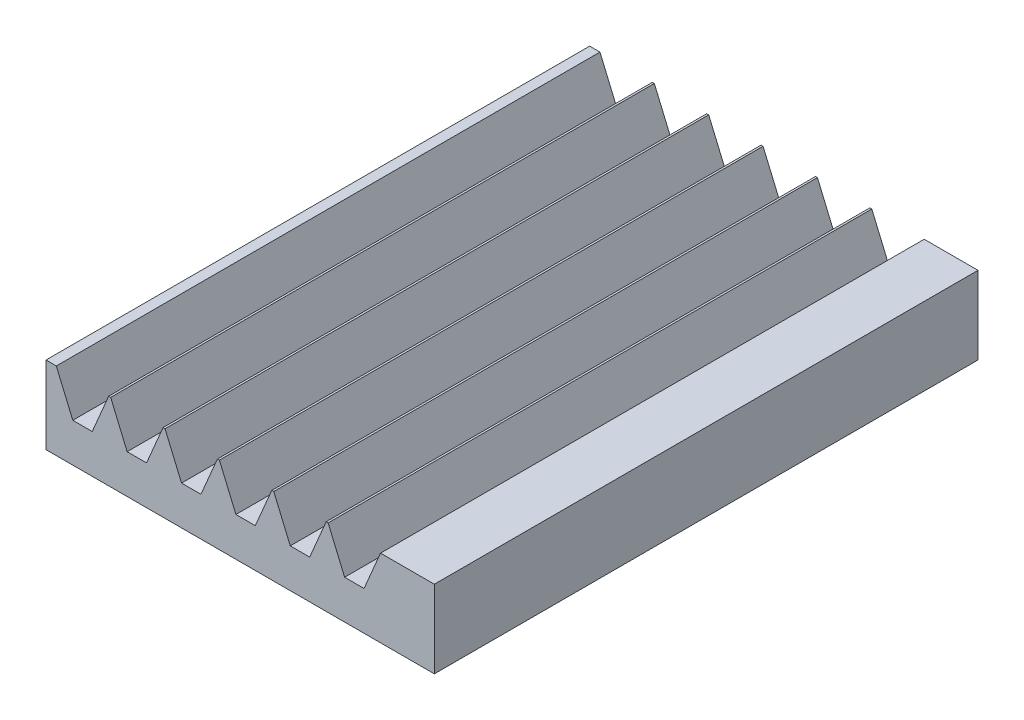
ISO-10303-21;
HEADER;
FILE_DESCRIPTION(('STEP AP214'),'2;1');
FILE_NAME('part.step','',(''),(''),'','','');
FILE_SCHEMA(('AUTOMOTIVE_DESIGN { 1 0 10303 214 1 1 1 1 }'));
ENDSEC;
DATA;
#1=APPLICATION_CONTEXT('core data for automotive mechanical design processes');
#2=APPLICATION_PROTOCOL_DEFINITION('international standard','automotive_design',2000,#1);
#3=PRODUCT_CONTEXT('',#1,'mechanical');
#4=PRODUCT('Part','Part','',(#3));
#5=PRODUCT_RELATED_PRODUCT_CATEGORY('part','',(#4));
#6=PRODUCT_DEFINITION_FORMATION('','',#4);
#7=PRODUCT_DEFINITION_CONTEXT('part definition',#1,'design');
#8=PRODUCT_DEFINITION('design','',#6,#7);
#9=PRODUCT_DEFINITION_SHAPE('','',#8);
#10=(LENGTH_UNIT() NAMED_UNIT(*) SI_UNIT(.MILLI.,.METRE.));
#11=(NAMED_UNIT(*) PLANE_ANGLE_UNIT() SI_UNIT($,.RADIAN.));
#12=(NAMED_UNIT(*) SI_UNIT($,.STERADIAN.) SOLID_ANGLE_UNIT());
#13=UNCERTAINTY_MEASURE_WITH_UNIT(LENGTH_MEASURE(1.E-05),#10,'distance_accuracy_value','');
#14=(GEOMETRIC_REPRESENTATION_CONTEXT(3) GLOBAL_UNCERTAINTY_ASSIGNED_CONTEXT((#13)) GLOBAL_UNIT_ASSIGNED_CONTEXT((#10,
#11,#12)) REPRESENTATION_CONTEXT('',''));
#15=CARTESIAN_POINT('',(0.,0.,0.));
#16=DIRECTION('',(0.,0.,1.));
#17=DIRECTION('',(1.,0.,0.));
#18=AXIS2_PLACEMENT_3D('',#15,#16,#17);
#19=CARTESIAN_POINT('',(0.,2.,-9.));
#20=DIRECTION('',(0.,1.,0.));
#21=DIRECTION('',(0.,0.,1.));
#22=AXIS2_PLACEMENT_3D('',#19,#20,#21);
#23=PLANE('',#22);
#24=DIRECTION('',(0.,0.,-1.));
#25=VECTOR('',#24,1.);
#26=CARTESIAN_POINT('',(3.01429944988273,2.,-9.));
#27=LINE('',#26,#25);
#28=CARTESIAN_POINT('',(3.01429944988273,2.,5.));
#29=VERTEX_POINT('',#28);
#30=CARTESIAN_POINT('',(3.01429944988273,2.,-9.));
#31=VERTEX_POINT('',#30);
#32=EDGE_CURVE('E321',#29,#31,#27,.T.);
#33=ORIENTED_EDGE('',*,*,#32,.F.);
#34=DIRECTION('',(-1.,0.,0.));
#35=VECTOR('',#34,1.);
#36=CARTESIAN_POINT('',(0.,2.,5.));
#37=LINE('',#36,#35);
#38=CARTESIAN_POINT('',(3.06534981746351,2.,5.));
#39=VERTEX_POINT('',#38);
#40=EDGE_CURVE('E396',#39,#29,#37,.T.);
#41=ORIENTED_EDGE('',*,*,#40,.F.);
#42=DIRECTION('',(0.,0.,1.));
#43=VECTOR('',#42,1.);
#44=CARTESIAN_POINT('',(3.06534981746351,2.,-9.));
#45=LINE('',#44,#43);
#46=CARTESIAN_POINT('',(3.06534981746351,2.,-9.));
#47=VERTEX_POINT('',#46);
#48=EDGE_CURVE('E55',#47,#39,#45,.T.);
#49=ORIENTED_EDGE('',*,*,#48,.F.);
#50=DIRECTION('',(-1.,0.,0.));
#51=VECTOR('',#50,1.);
#52=CARTESIAN_POINT('',(0.,2.,-9.));
#53=LINE('',#52,#51);
#54=EDGE_CURVE('E500',#47,#31,#53,.T.);
#55=ORIENTED_EDGE('',*,*,#54,.T.);
#56=EDGE_LOOP('',(#33,#41,#49,#55));
#57=FACE_BOUND('',#56,.T.);
#58=ADVANCED_FACE('F33',(#57),#23,.T.);
#59=DIRECTION('',(0.,0.,-1.));
#60=VECTOR('',#59,1.);
#61=CARTESIAN_POINT('',(4.41429944988273,2.,-9.));
#62=LINE('',#61,#60);
#63=CARTESIAN_POINT('',(4.41429944988273,2.,5.));
#64=VERTEX_POINT('',#63);
#65=CARTESIAN_POINT('',(4.41429944988273,2.,-9.));
#66=VERTEX_POINT('',#65);
#67=EDGE_CURVE('E313',#64,#66,#62,.T.);
#68=ORIENTED_EDGE('',*,*,#67,.F.);
#69=CARTESIAN_POINT('',(4.46534981746351,2.,5.));
#70=VERTEX_POINT('',#69);
#71=EDGE_CURVE('E403',#70,#64,#37,.T.);
#72=ORIENTED_EDGE('',*,*,#71,.F.);
#73=DIRECTION('',(0.,0.,1.));
#74=VECTOR('',#73,1.);
#75=CARTESIAN_POINT('',(4.46534981746351,2.,-9.));
#76=LINE('',#75,#74);
#77=CARTESIAN_POINT('',(4.46534981746351,2.,-9.));
#78=VERTEX_POINT('',#77);
#79=EDGE_CURVE('E298',#78,#70,#76,.T.);
#80=ORIENTED_EDGE('',*,*,#79,.F.);
#81=EDGE_CURVE('E447',#78,#66,#53,.T.);
#82=ORIENTED_EDGE('',*,*,#81,.T.);
#83=EDGE_LOOP('',(#68,#72,#80,#82));
#84=FACE_BOUND('',#83,.T.);
#85=ADVANCED_FACE('F445',(#84),#23,.T.);
#86=DIRECTION('',(0.,0.,-1.));
#87=VECTOR('',#86,1.);
#88=CARTESIAN_POINT('',(5.81429944988273,2.,-9.));
#89=LINE('',#88,#87);
#90=CARTESIAN_POINT('',(5.81429944988273,2.,5.));
#91=VERTEX_POINT('',#90);
#92=CARTESIAN_POINT('',(5.81429944988273,2.,-9.));
#93=VERTEX_POINT('',#92);
#94=EDGE_CURVE('E304',#91,#93,#89,.T.);
#95=ORIENTED_EDGE('',*,*,#94,.F.);
#96=CARTESIAN_POINT('',(5.86534981746351,2.,5.));
#97=VERTEX_POINT('',#96);
#98=EDGE_CURVE('E405',#97,#91,#37,.T.);
#99=ORIENTED_EDGE('',*,*,#98,.F.);
#100=DIRECTION('',(0.,0.,1.));
#101=VECTOR('',#100,1.);
#102=CARTESIAN_POINT('',(5.86534981746351,2.,-9.));
#103=LINE('',#102,#101);
#104=CARTESIAN_POINT('',(5.86534981746351,2.,-9.));
#105=VERTEX_POINT('',#104);
#106=EDGE_CURVE('E288',#105,#97,#103,.T.);
#107=ORIENTED_EDGE('',*,*,#106,.F.);
#108=EDGE_CURVE('E423',#105,#93,#53,.T.);
#109=ORIENTED_EDGE('',*,*,#108,.T.);
#110=EDGE_LOOP('',(#95,#99,#107,#109));
#111=FACE_BOUND('',#110,.T.);
#112=ADVANCED_FACE('F420',(#111),#23,.T.);
#113=DIRECTION('',(0.,0.,-1.));
#114=VECTOR('',#113,1.);
#115=CARTESIAN_POINT('',(7.21429944988273,2.,-9.));
#116=LINE('',#115,#114);
#117=CARTESIAN_POINT('',(7.21429944988273,2.,5.));
#118=VERTEX_POINT('',#117);
#119=CARTESIAN_POINT('',(7.21429944988273,2.,-9.));
#120=VERTEX_POINT('',#119);
#121=EDGE_CURVE('E294',#118,#120,#116,.T.);
#122=ORIENTED_EDGE('',*,*,#121,.F.);
#123=CARTESIAN_POINT('',(7.26534981746351,2.,5.));
#124=VERTEX_POINT('',#123);
#125=EDGE_CURVE('E358',#124,#118,#37,.T.);
#126=ORIENTED_EDGE('',*,*,#125,.F.);
#127=DIRECTION('',(0.,0.,1.));
#128=VECTOR('',#127,1.);
#129=CARTESIAN_POINT('',(7.26534981746351,2.,-9.));
#130=LINE('',#129,#128);
#131=CARTESIAN_POINT('',(7.26534981746351,2.,-9.));
#132=VERTEX_POINT('',#131);
#133=EDGE_CURVE('E278',#132,#124,#130,.T.);
#134=ORIENTED_EDGE('',*,*,#133,.F.);
#135=EDGE_CURVE('E373',#132,#120,#53,.T.);
#136=ORIENTED_EDGE('',*,*,#135,.T.);
#137=EDGE_LOOP('',(#122,#126,#134,#136));
#138=FACE_BOUND('',#137,.T.);
#139=ADVANCED_FACE('F494',(#138),#23,.T.);
#140=DIRECTION('',(0.,0.,-1.));
#141=VECTOR('',#140,1.);
#142=CARTESIAN_POINT('',(8.61429944988273,2.,-9.));
#143=LINE('',#142,#141);
#144=CARTESIAN_POINT('',(8.61429944988273,2.,5.));
#145=VERTEX_POINT('',#144);
#146=CARTESIAN_POINT('',(8.61429944988273,2.,-9.));
#147=VERTEX_POINT('',#146);
#148=EDGE_CURVE('E284',#145,#147,#143,.T.);
#149=ORIENTED_EDGE('',*,*,#148,.F.);
#150=CARTESIAN_POINT('',(10.,2.,5.));
#151=VERTEX_POINT('',#150);
#152=EDGE_CURVE('E354',#151,#145,#37,.T.);
#153=ORIENTED_EDGE('',*,*,#152,.F.);
#154=DIRECTION('',(0.,0.,1.));
#155=VECTOR('',#154,1.);
#156=CARTESIAN_POINT('',(10.,2.,-9.));
#157=LINE('',#156,#155);
#158=CARTESIAN_POINT('',(10.,2.,-9.));
#159=VERTEX_POINT('',#158);
#160=EDGE_CURVE('E379',#159,#151,#157,.T.);
#161=ORIENTED_EDGE('',*,*,#160,.F.);
#162=EDGE_CURVE('E369',#159,#147,#53,.T.);
#163=ORIENTED_EDGE('',*,*,#162,.T.);
#164=EDGE_LOOP('',(#149,#153,#161,#163));
#165=FACE_BOUND('',#164,.T.);
#166=ADVANCED_FACE('F489',(#165),#23,.T.);
#167=DIRECTION('',(0.,0.,1.));
#168=VECTOR('',#167,1.);
#169=CARTESIAN_POINT('',(1.66534981746351,2.,-9.));
#170=LINE('',#169,#168);
#171=CARTESIAN_POINT('',(1.66534981746351,2.,-9.));
#172=VERTEX_POINT('',#171);
#173=CARTESIAN_POINT('',(1.66534981746351,2.,5.));
#174=VERTEX_POINT('',#173);
#175=EDGE_CURVE('E48',#172,#174,#170,.T.);
#176=ORIENTED_EDGE('',*,*,#175,.F.);
#177=CARTESIAN_POINT('',(1.61429944988273,2.,-9.));
#178=VERTEX_POINT('',#177);
#179=EDGE_CURVE('E374',#172,#178,#53,.T.);
#180=ORIENTED_EDGE('',*,*,#179,.T.);
#181=DIRECTION('',(0.,0.,-1.));
#182=VECTOR('',#181,1.);
#183=CARTESIAN_POINT('',(1.61429944988273,2.,-9.));
#184=LINE('',#183,#182);
#185=CARTESIAN_POINT('',(1.61429944988273,2.,5.));
#186=VERTEX_POINT('',#185);
#187=EDGE_CURVE('E341',#186,#178,#184,.T.);
#188=ORIENTED_EDGE('',*,*,#187,.F.);
#189=EDGE_CURVE('E359',#174,#186,#37,.T.);
#190=ORIENTED_EDGE('',*,*,#189,.F.);
#191=EDGE_LOOP('',(#176,#180,#188,#190));
#192=FACE_BOUND('',#191,.T.);
#193=ADVANCED_FACE('F479',(#192),#23,.T.);
#194=CARTESIAN_POINT('',(0.,0.,-9.));
#195=DIRECTION('',(-1.,0.,0.));
#196=DIRECTION('',(0.,0.,1.));
#197=AXIS2_PLACEMENT_3D('',#194,#195,#196);
#198=PLANE('',#197);
#199=DIRECTION('',(0.,0.,1.));
#200=VECTOR('',#199,1.);
#201=CARTESIAN_POINT('',(0.,0.,-9.));
#202=LINE('',#201,#200);
#203=CARTESIAN_POINT('',(0.,0.,-9.));
#204=VERTEX_POINT('',#203);
#205=CARTESIAN_POINT('',(0.,0.,5.));
#206=VERTEX_POINT('',#205);
#207=EDGE_CURVE('E372',#204,#206,#202,.T.);
#208=ORIENTED_EDGE('',*,*,#207,.T.);
#209=DIRECTION('',(0.,-1.,0.));
#210=VECTOR('',#209,1.);
#211=CARTESIAN_POINT('',(0.,0.,5.));
#212=LINE('',#211,#210);
#213=CARTESIAN_POINT('',(0.,2.,5.));
#214=VERTEX_POINT('',#213);
#215=EDGE_CURVE('E344',#214,#206,#212,.T.);
#216=ORIENTED_EDGE('',*,*,#215,.F.);
#217=DIRECTION('',(0.,0.,1.));
#218=VECTOR('',#217,1.);
#219=CARTESIAN_POINT('',(0.,2.,-9.));
#220=LINE('',#219,#218);
#221=CARTESIAN_POINT('',(0.,2.,-9.));
#222=VERTEX_POINT('',#221);
#223=EDGE_CURVE('E375',#222,#214,#220,.T.);
#224=ORIENTED_EDGE('',*,*,#223,.F.);
#225=DIRECTION('',(0.,-1.,0.));
#226=VECTOR('',#225,1.);
#227=CARTESIAN_POINT('',(0.,0.,-9.));
#228=LINE('',#227,#226);
#229=EDGE_CURVE('E357',#222,#204,#228,.T.);
#230=ORIENTED_EDGE('',*,*,#229,.T.);
#231=EDGE_LOOP('',(#208,#216,#224,#230));
#232=FACE_BOUND('',#231,.T.);
#233=ADVANCED_FACE('F35',(#232),#198,.T.);
#234=DIRECTION('',(0.,0.,1.));
#235=VECTOR('',#234,1.);
#236=CARTESIAN_POINT('',(0.265349817463512,2.,-9.));
#237=LINE('',#236,#235);
#238=CARTESIAN_POINT('',(0.265349817463512,2.,-9.));
#239=VERTEX_POINT('',#238);
#240=CARTESIAN_POINT('',(0.265349817463512,2.,5.));
#241=VERTEX_POINT('',#240);
#242=EDGE_CURVE('E335',#239,#241,#237,.T.);
#243=ORIENTED_EDGE('',*,*,#242,.F.);
#244=EDGE_CURVE('E368',#239,#222,#53,.T.);
#245=ORIENTED_EDGE('',*,*,#244,.T.);
#246=ORIENTED_EDGE('',*,*,#223,.T.);
#247=EDGE_CURVE('E353',#241,#214,#37,.T.);
#248=ORIENTED_EDGE('',*,*,#247,.F.);
#249=EDGE_LOOP('',(#243,#245,#246,#248));
#250=FACE_BOUND('',#249,.T.);
#251=ADVANCED_FACE('F470',(#250),#23,.T.);
#252=CARTESIAN_POINT('',(10.,0.,-9.));
#253=DIRECTION('',(1.,0.,0.));
#254=DIRECTION('',(0.,0.,-1.));
#255=AXIS2_PLACEMENT_3D('',#252,#253,#254);
#256=PLANE('',#255);
#257=ORIENTED_EDGE('',*,*,#160,.T.);
#258=DIRECTION('',(0.,1.,0.));
#259=VECTOR('',#258,1.);
#260=CARTESIAN_POINT('',(10.,0.,5.));
#261=LINE('',#260,#259);
#262=CARTESIAN_POINT('',(10.,0.,5.));
#263=VERTEX_POINT('',#262);
#264=EDGE_CURVE('E350',#263,#151,#261,.T.);
#265=ORIENTED_EDGE('',*,*,#264,.F.);
#266=DIRECTION('',(0.,0.,1.));
#267=VECTOR('',#266,1.);
#268=CARTESIAN_POINT('',(10.,0.,-9.));
#269=LINE('',#268,#267);
#270=CARTESIAN_POINT('',(10.,0.,-9.));
#271=VERTEX_POINT('',#270);
#272=EDGE_CURVE('E381',#271,#263,#269,.T.);
#273=ORIENTED_EDGE('',*,*,#272,.F.);
#274=DIRECTION('',(0.,1.,0.));
#275=VECTOR('',#274,1.);
#276=CARTESIAN_POINT('',(10.,0.,-9.));
#277=LINE('',#276,#275);
#278=EDGE_CURVE('E365',#271,#159,#277,.T.);
#279=ORIENTED_EDGE('',*,*,#278,.T.);
#280=EDGE_LOOP('',(#257,#265,#273,#279));
#281=FACE_BOUND('',#280,.T.);
#282=ADVANCED_FACE('F477',(#281),#256,.T.);
#283=CARTESIAN_POINT('',(0.,0.,-9.));
#284=DIRECTION('',(0.,-1.,0.));
#285=DIRECTION('',(0.,0.,-1.));
#286=AXIS2_PLACEMENT_3D('',#283,#284,#285);
#287=PLANE('',#286);
#288=ORIENTED_EDGE('',*,*,#272,.T.);
#289=DIRECTION('',(1.,0.,0.));
#290=VECTOR('',#289,1.);
#291=CARTESIAN_POINT('',(0.,0.,5.));
#292=LINE('',#291,#290);
#293=EDGE_CURVE('E347',#206,#263,#292,.T.);
#294=ORIENTED_EDGE('',*,*,#293,.F.);
#295=ORIENTED_EDGE('',*,*,#207,.F.);
#296=DIRECTION('',(1.,0.,0.));
#297=VECTOR('',#296,1.);
#298=CARTESIAN_POINT('',(0.,0.,-9.));
#299=LINE('',#298,#297);
#300=EDGE_CURVE('E362',#204,#271,#299,.T.);
#301=ORIENTED_EDGE('',*,*,#300,.T.);
#302=EDGE_LOOP('',(#288,#294,#295,#301));
#303=FACE_BOUND('',#302,.T.);
#304=ADVANCED_FACE('F484',(#303),#287,.T.);
#305=CARTESIAN_POINT('',(0.,0.,-9.));
#306=DIRECTION('',(0.,0.,-1.));
#307=DIRECTION('',(-1.,0.,0.));
#308=AXIS2_PLACEMENT_3D('',#305,#306,#307);
#309=PLANE('',#308);
#310=DIRECTION('',(-0.390731128489278,-0.920504853452439,0.));
#311=VECTOR('',#310,1.);
#312=CARTESIAN_POINT('',(1.83476409656819,-0.778811152678775,-9.));
#313=LINE('',#312,#311);
#314=CARTESIAN_POINT('',(2.58982463367312,1.,-9.));
#315=VERTEX_POINT('',#314);
#316=EDGE_CURVE('E319',#31,#315,#313,.T.);
#317=ORIENTED_EDGE('',*,*,#316,.F.);
#318=ORIENTED_EDGE('',*,*,#54,.F.);
#319=DIRECTION('',(-0.390731128489278,0.920504853452439,0.));
#320=VECTOR('',#319,1.);
#321=CARTESIAN_POINT('',(3.3167001636134,1.40785569237218,-9.));
#322=LINE('',#321,#320);
#323=CARTESIAN_POINT('',(3.48982463367312,1.,-9.));
#324=VERTEX_POINT('',#323);
#325=EDGE_CURVE('E306',#324,#47,#322,.T.);
#326=ORIENTED_EDGE('',*,*,#325,.F.);
#327=DIRECTION('',(-1.,0.,0.));
#328=VECTOR('',#327,1.);
#329=CARTESIAN_POINT('',(0.,1.,-9.));
#330=LINE('',#329,#328);
#331=CARTESIAN_POINT('',(3.98982463367312,1.,-9.));
#332=VERTEX_POINT('',#331);
#333=EDGE_CURVE('E309',#332,#324,#330,.T.);
#334=ORIENTED_EDGE('',*,*,#333,.F.);
#335=DIRECTION('',(-0.390731128489278,-0.920504853452439,0.));
#336=VECTOR('',#335,1.);
#337=CARTESIAN_POINT('',(3.02102495588949,-1.28234901291583,-9.));
#338=LINE('',#337,#336);
#339=EDGE_CURVE('E311',#66,#332,#338,.T.);
#340=ORIENTED_EDGE('',*,*,#339,.F.);
#341=ORIENTED_EDGE('',*,*,#81,.F.);
#342=DIRECTION('',(-0.390731128489278,0.920504853452439,0.));
#343=VECTOR('',#342,1.);
#344=CARTESIAN_POINT('',(4.50296102293469,1.91139355260924,-9.));
#345=LINE('',#344,#343);
#346=CARTESIAN_POINT('',(4.88982463367312,1.,-9.));
#347=VERTEX_POINT('',#346);
#348=EDGE_CURVE('E296',#347,#78,#345,.T.);
#349=ORIENTED_EDGE('',*,*,#348,.F.);
#350=DIRECTION('',(-1.,0.,0.));
#351=VECTOR('',#350,1.);
#352=CARTESIAN_POINT('',(0.,1.,-9.));
#353=LINE('',#352,#351);
#354=CARTESIAN_POINT('',(5.38982463367312,1.,-9.));
#355=VERTEX_POINT('',#354);
#356=EDGE_CURVE('E300',#355,#347,#353,.T.);
#357=ORIENTED_EDGE('',*,*,#356,.F.);
#358=DIRECTION('',(-0.390731128489278,-0.920504853452439,0.));
#359=VECTOR('',#358,1.);
#360=CARTESIAN_POINT('',(4.20728581521078,-1.78588687315289,-9.));
#361=LINE('',#360,#359);
#362=EDGE_CURVE('E302',#93,#355,#361,.T.);
#363=ORIENTED_EDGE('',*,*,#362,.F.);
#364=ORIENTED_EDGE('',*,*,#108,.F.);
#365=DIRECTION('',(-0.390731128489278,0.920504853452439,0.));
#366=VECTOR('',#365,1.);
#367=CARTESIAN_POINT('',(5.68922188225598,2.4149314128463,-9.));
#368=LINE('',#367,#366);
#369=CARTESIAN_POINT('',(6.28982463367312,1.,-9.));
#370=VERTEX_POINT('',#369);
#371=EDGE_CURVE('E286',#370,#105,#368,.T.);
#372=ORIENTED_EDGE('',*,*,#371,.F.);
#373=DIRECTION('',(-1.,0.,0.));
#374=VECTOR('',#373,1.);
#375=CARTESIAN_POINT('',(0.,1.,-9.));
#376=LINE('',#375,#374);
#377=CARTESIAN_POINT('',(6.78982463367312,1.,-9.));
#378=VERTEX_POINT('',#377);
#379=EDGE_CURVE('E290',#378,#370,#376,.T.);
#380=ORIENTED_EDGE('',*,*,#379,.F.);
#381=DIRECTION('',(-0.390731128489278,-0.920504853452439,0.));
#382=VECTOR('',#381,1.);
#383=CARTESIAN_POINT('',(5.39354667453208,-2.28942473338995,-9.));
#384=LINE('',#383,#382);
#385=EDGE_CURVE('E292',#120,#378,#384,.T.);
#386=ORIENTED_EDGE('',*,*,#385,.F.);
#387=ORIENTED_EDGE('',*,*,#135,.F.);
#388=DIRECTION('',(-0.390731128489278,0.920504853452439,0.));
#389=VECTOR('',#388,1.);
#390=CARTESIAN_POINT('',(6.87548274157728,2.91846927308336,-9.));
#391=LINE('',#390,#389);
#392=CARTESIAN_POINT('',(7.68982463367312,1.,-9.));
#393=VERTEX_POINT('',#392);
#394=EDGE_CURVE('E240',#393,#132,#391,.T.);
#395=ORIENTED_EDGE('',*,*,#394,.F.);
#396=DIRECTION('',(-1.,0.,0.));
#397=VECTOR('',#396,1.);
#398=CARTESIAN_POINT('',(0.,1.,-9.));
#399=LINE('',#398,#397);
#400=CARTESIAN_POINT('',(8.18982463367312,1.,-9.));
#401=VERTEX_POINT('',#400);
#402=EDGE_CURVE('E280',#401,#393,#399,.T.);
#403=ORIENTED_EDGE('',*,*,#402,.F.);
#404=DIRECTION('',(-0.390731128489278,-0.920504853452439,0.));
#405=VECTOR('',#404,1.);
#406=CARTESIAN_POINT('',(6.57980753385337,-2.79296259362701,-9.));
#407=LINE('',#406,#405);
#408=EDGE_CURVE('E282',#147,#401,#407,.T.);
#409=ORIENTED_EDGE('',*,*,#408,.F.);
#410=ORIENTED_EDGE('',*,*,#162,.F.);
#411=ORIENTED_EDGE('',*,*,#278,.F.);
#412=ORIENTED_EDGE('',*,*,#300,.F.);
#413=ORIENTED_EDGE('',*,*,#229,.F.);
#414=ORIENTED_EDGE('',*,*,#244,.F.);
#415=DIRECTION('',(-0.390731128489278,0.920504853452439,0.));
#416=VECTOR('',#415,1.);
#417=CARTESIAN_POINT('',(0.94417844497081,0.40077997189806,-9.));
#418=LINE('',#417,#416);
#419=CARTESIAN_POINT('',(0.689824633673122,1.,-9.));
#420=VERTEX_POINT('',#419);
#421=EDGE_CURVE('E332',#420,#239,#418,.T.);
#422=ORIENTED_EDGE('',*,*,#421,.F.);
#423=DIRECTION('',(-1.,0.,0.));
#424=VECTOR('',#423,1.);
#425=CARTESIAN_POINT('',(0.,1.,-9.));
#426=LINE('',#425,#424);
#427=CARTESIAN_POINT('',(1.18982463367312,1.,-9.));
#428=VERTEX_POINT('',#427);
#429=EDGE_CURVE('E337',#428,#420,#426,.T.);
#430=ORIENTED_EDGE('',*,*,#429,.F.);
#431=DIRECTION('',(-0.390731128489278,-0.920504853452439,0.));
#432=VECTOR('',#431,1.);
#433=CARTESIAN_POINT('',(0.648503237246901,-0.275273292441715,-9.));
#434=LINE('',#433,#432);
#435=EDGE_CURVE('E339',#178,#428,#434,.T.);
#436=ORIENTED_EDGE('',*,*,#435,.F.);
#437=ORIENTED_EDGE('',*,*,#179,.F.);
#438=DIRECTION('',(-0.390731128489278,0.920504853452439,0.));
#439=VECTOR('',#438,1.);
#440=CARTESIAN_POINT('',(2.1304393042921,0.90431783213512,-9.));
#441=LINE('',#440,#439);
#442=CARTESIAN_POINT('',(2.08982463367312,1.,-9.));
#443=VERTEX_POINT('',#442);
#444=EDGE_CURVE('E315',#443,#172,#441,.T.);
#445=ORIENTED_EDGE('',*,*,#444,.F.);
#446=DIRECTION('',(-1.,0.,0.));
#447=VECTOR('',#446,1.);
#448=CARTESIAN_POINT('',(0.,1.,-9.));
#449=LINE('',#448,#447);
#450=EDGE_CURVE('E226',#315,#443,#449,.T.);
#451=ORIENTED_EDGE('',*,*,#450,.F.);
#452=EDGE_LOOP('',(#317,#318,#326,#334,#340,#341,#349,#357,#363,#364,#372,#380,#386,#387,#395,
#403,#409,#410,#411,#412,#413,#414,#422,#430,#436,#437,#445,#451));
#453=FACE_BOUND('',#452,.T.);
#454=ADVANCED_FACE('F431',(#453),#309,.T.);
#455=CARTESIAN_POINT('',(0.,0.,5.));
#456=DIRECTION('',(0.,0.,-1.));
#457=DIRECTION('',(-1.,0.,0.));
#458=AXIS2_PLACEMENT_3D('',#455,#456,#457);
#459=PLANE('',#458);
#460=ORIENTED_EDGE('',*,*,#40,.T.);
#461=DIRECTION('',(0.390731128489277,0.920504853452439,0.));
#462=VECTOR('',#461,1.);
#463=CARTESIAN_POINT('',(3.01962887501133,2.01255533879768,5.));
#464=LINE('',#463,#462);
#465=CARTESIAN_POINT('',(2.58982463367312,1.,5.));
#466=VERTEX_POINT('',#465);
#467=EDGE_CURVE('E235',#466,#29,#464,.T.);
#468=ORIENTED_EDGE('',*,*,#467,.F.);
#469=DIRECTION('',(1.,0.,0.));
#470=VECTOR('',#469,1.);
#471=CARTESIAN_POINT('',(2.08982463367312,1.,5.));
#472=LINE('',#471,#470);
#473=CARTESIAN_POINT('',(2.08982463367312,1.,5.));
#474=VERTEX_POINT('',#473);
#475=EDGE_CURVE('E223',#474,#466,#472,.T.);
#476=ORIENTED_EDGE('',*,*,#475,.F.);
#477=DIRECTION('',(-0.390731128489278,0.920504853452439,0.));
#478=VECTOR('',#477,1.);
#479=CARTESIAN_POINT('',(2.1304393042921,0.90431783213512,5.));
#480=LINE('',#479,#478);
#481=EDGE_CURVE('E11',#474,#174,#480,.T.);
#482=ORIENTED_EDGE('',*,*,#481,.T.);
#483=ORIENTED_EDGE('',*,*,#189,.T.);
#484=DIRECTION('',(0.390731128489277,0.920504853452439,0.));
#485=VECTOR('',#484,1.);
#486=CARTESIAN_POINT('',(1.61962887501133,2.01255533879768,5.));
#487=LINE('',#486,#485);
#488=CARTESIAN_POINT('',(1.18982463367312,1.,5.));
#489=VERTEX_POINT('',#488);
#490=EDGE_CURVE('E323',#489,#186,#487,.T.);
#491=ORIENTED_EDGE('',*,*,#490,.F.);
#492=DIRECTION('',(1.,0.,0.));
#493=VECTOR('',#492,1.);
#494=CARTESIAN_POINT('',(0.689824633673122,1.,5.));
#495=LINE('',#494,#493);
#496=CARTESIAN_POINT('',(0.689824633673122,1.,5.));
#497=VERTEX_POINT('',#496);
#498=EDGE_CURVE('E326',#497,#489,#495,.T.);
#499=ORIENTED_EDGE('',*,*,#498,.F.);
#500=DIRECTION('',(-0.390731128489278,0.920504853452439,0.));
#501=VECTOR('',#500,1.);
#502=CARTESIAN_POINT('',(0.94417844497081,0.40077997189806,5.));
#503=LINE('',#502,#501);
#504=EDGE_CURVE('E378',#497,#241,#503,.T.);
#505=ORIENTED_EDGE('',*,*,#504,.T.);
#506=ORIENTED_EDGE('',*,*,#247,.T.);
#507=ORIENTED_EDGE('',*,*,#215,.T.);
#508=ORIENTED_EDGE('',*,*,#293,.T.);
#509=ORIENTED_EDGE('',*,*,#264,.T.);
#510=ORIENTED_EDGE('',*,*,#152,.T.);
#511=DIRECTION('',(0.390731128489277,0.920504853452439,0.));
#512=VECTOR('',#511,1.);
#513=CARTESIAN_POINT('',(8.61962887501133,2.01255533879768,5.));
#514=LINE('',#513,#512);
#515=CARTESIAN_POINT('',(8.18982463367312,1.,5.));
#516=VERTEX_POINT('',#515);
#517=EDGE_CURVE('E269',#516,#145,#514,.T.);
#518=ORIENTED_EDGE('',*,*,#517,.F.);
#519=DIRECTION('',(1.,0.,0.));
#520=VECTOR('',#519,1.);
#521=CARTESIAN_POINT('',(7.68982463367312,1.,5.));
#522=LINE('',#521,#520);
#523=CARTESIAN_POINT('',(7.68982463367312,1.,5.));
#524=VERTEX_POINT('',#523);
#525=EDGE_CURVE('E271',#524,#516,#522,.T.);
#526=ORIENTED_EDGE('',*,*,#525,.F.);
#527=DIRECTION('',(-0.390731128489278,0.920504853452439,0.));
#528=VECTOR('',#527,1.);
#529=CARTESIAN_POINT('',(6.87548274157728,2.91846927308336,5.));
#530=LINE('',#529,#528);
#531=EDGE_CURVE('E386',#524,#124,#530,.T.);
#532=ORIENTED_EDGE('',*,*,#531,.T.);
#533=ORIENTED_EDGE('',*,*,#125,.T.);
#534=DIRECTION('',(0.390731128489277,0.920504853452439,0.));
#535=VECTOR('',#534,1.);
#536=CARTESIAN_POINT('',(7.21962887501133,2.01255533879768,5.));
#537=LINE('',#536,#535);
#538=CARTESIAN_POINT('',(6.78982463367312,1.,5.));
#539=VERTEX_POINT('',#538);
#540=EDGE_CURVE('E260',#539,#118,#537,.T.);
#541=ORIENTED_EDGE('',*,*,#540,.F.);
#542=DIRECTION('',(1.,0.,0.));
#543=VECTOR('',#542,1.);
#544=CARTESIAN_POINT('',(6.28982463367312,1.,5.));
#545=LINE('',#544,#543);
#546=CARTESIAN_POINT('',(6.28982463367312,1.,5.));
#547=VERTEX_POINT('',#546);
#548=EDGE_CURVE('E262',#547,#539,#545,.T.);
#549=ORIENTED_EDGE('',*,*,#548,.F.);
#550=DIRECTION('',(-0.390731128489278,0.920504853452439,0.));
#551=VECTOR('',#550,1.);
#552=CARTESIAN_POINT('',(5.68922188225598,2.4149314128463,5.));
#553=LINE('',#552,#551);
#554=EDGE_CURVE('E389',#547,#97,#553,.T.);
#555=ORIENTED_EDGE('',*,*,#554,.T.);
#556=ORIENTED_EDGE('',*,*,#98,.T.);
#557=DIRECTION('',(0.390731128489277,0.920504853452439,0.));
#558=VECTOR('',#557,1.);
#559=CARTESIAN_POINT('',(5.81962887501133,2.01255533879768,5.));
#560=LINE('',#559,#558);
#561=CARTESIAN_POINT('',(5.38982463367312,1.,5.));
#562=VERTEX_POINT('',#561);
#563=EDGE_CURVE('E251',#562,#91,#560,.T.);
#564=ORIENTED_EDGE('',*,*,#563,.F.);
#565=DIRECTION('',(1.,0.,0.));
#566=VECTOR('',#565,1.);
#567=CARTESIAN_POINT('',(4.88982463367312,1.,5.));
#568=LINE('',#567,#566);
#569=CARTESIAN_POINT('',(4.88982463367312,1.,5.));
#570=VERTEX_POINT('',#569);
#571=EDGE_CURVE('E253',#570,#562,#568,.T.);
#572=ORIENTED_EDGE('',*,*,#571,.F.);
#573=DIRECTION('',(-0.390731128489278,0.920504853452439,0.));
#574=VECTOR('',#573,1.);
#575=CARTESIAN_POINT('',(4.50296102293469,1.91139355260924,5.));
#576=LINE('',#575,#574);
#577=EDGE_CURVE('E392',#570,#70,#576,.T.);
#578=ORIENTED_EDGE('',*,*,#577,.T.);
#579=ORIENTED_EDGE('',*,*,#71,.T.);
#580=DIRECTION('',(0.390731128489277,0.920504853452439,0.));
#581=VECTOR('',#580,1.);
#582=CARTESIAN_POINT('',(4.41962887501133,2.01255533879768,5.));
#583=LINE('',#582,#581);
#584=CARTESIAN_POINT('',(3.98982463367312,1.,5.));
#585=VERTEX_POINT('',#584);
#586=EDGE_CURVE('E242',#585,#64,#583,.T.);
#587=ORIENTED_EDGE('',*,*,#586,.F.);
#588=DIRECTION('',(1.,0.,0.));
#589=VECTOR('',#588,1.);
#590=CARTESIAN_POINT('',(3.48982463367312,1.,5.));
#591=LINE('',#590,#589);
#592=CARTESIAN_POINT('',(3.48982463367312,1.,5.));
#593=VERTEX_POINT('',#592);
#594=EDGE_CURVE('E244',#593,#585,#591,.T.);
#595=ORIENTED_EDGE('',*,*,#594,.F.);
#596=DIRECTION('',(-0.390731128489278,0.920504853452439,0.));
#597=VECTOR('',#596,1.);
#598=CARTESIAN_POINT('',(3.3167001636134,1.40785569237218,5.));
#599=LINE('',#598,#597);
#600=EDGE_CURVE('E41',#593,#39,#599,.T.);
#601=ORIENTED_EDGE('',*,*,#600,.T.);
#602=EDGE_LOOP('',(#460,#468,#476,#482,#483,#491,#499,#505,#506,#507,#508,#509,#510,#518,#526,
#532,#533,#541,#549,#555,#556,#564,#572,#578,#579,#587,#595,#601));
#603=FACE_BOUND('',#602,.T.);
#604=ADVANCED_FACE('F234',(#603),#459,.F.);
#605=CARTESIAN_POINT('',(1.61962887501133,2.01255533879768,-13.));
#606=DIRECTION('',(0.920504853452439,-0.390731128489278,0.));
#607=DIRECTION('',(0.390731128489278,0.920504853452439,0.));
#608=AXIS2_PLACEMENT_3D('',#605,#606,#607);
#609=PLANE('',#608);
#610=ORIENTED_EDGE('',*,*,#187,.T.);
#611=ORIENTED_EDGE('',*,*,#435,.T.);
#612=DIRECTION('',(0.,0.,1.));
#613=VECTOR('',#612,1.);
#614=CARTESIAN_POINT('',(1.18982463367312,1.,-13.));
#615=LINE('',#614,#613);
#616=EDGE_CURVE('E330',#428,#489,#615,.T.);
#617=ORIENTED_EDGE('',*,*,#616,.T.);
#618=ORIENTED_EDGE('',*,*,#490,.T.);
#619=EDGE_LOOP('',(#610,#611,#617,#618));
#620=FACE_BOUND('',#619,.T.);
#621=ADVANCED_FACE('F547',(#620),#609,.F.);
#622=CARTESIAN_POINT('',(0.689824633673122,1.,-13.));
#623=DIRECTION('',(0.,-1.,0.));
#624=DIRECTION('',(0.,0.,-1.));
#625=AXIS2_PLACEMENT_3D('',#622,#623,#624);
#626=PLANE('',#625);
#627=ORIENTED_EDGE('',*,*,#429,.T.);
#628=DIRECTION('',(0.,0.,1.));
#629=VECTOR('',#628,1.);
#630=CARTESIAN_POINT('',(0.689824633673122,1.,-13.));
#631=LINE('',#630,#629);
#632=EDGE_CURVE('E329',#420,#497,#631,.T.);
#633=ORIENTED_EDGE('',*,*,#632,.T.);
#634=ORIENTED_EDGE('',*,*,#498,.T.);
#635=ORIENTED_EDGE('',*,*,#616,.F.);
#636=EDGE_LOOP('',(#627,#633,#634,#635));
#637=FACE_BOUND('',#636,.T.);
#638=ADVANCED_FACE('F544',(#637),#626,.F.);
#639=CARTESIAN_POINT('',(0.689824633673122,1.,-13.));
#640=DIRECTION('',(-0.920504853452439,-0.390731128489278,0.));
#641=DIRECTION('',(0.390731128489278,-0.920504853452439,0.));
#642=AXIS2_PLACEMENT_3D('',#639,#640,#641);
#643=PLANE('',#642);
#644=ORIENTED_EDGE('',*,*,#242,.T.);
#645=ORIENTED_EDGE('',*,*,#504,.F.);
#646=ORIENTED_EDGE('',*,*,#632,.F.);
#647=ORIENTED_EDGE('',*,*,#421,.T.);
#648=EDGE_LOOP('',(#644,#645,#646,#647));
#649=FACE_BOUND('',#648,.T.);
#650=ADVANCED_FACE('F542',(#649),#643,.F.);
#651=CARTESIAN_POINT('',(8.61962887501133,2.01255533879768,-13.));
#652=DIRECTION('',(0.920504853452439,-0.390731128489278,0.));
#653=DIRECTION('',(0.390731128489278,0.920504853452439,0.));
#654=AXIS2_PLACEMENT_3D('',#651,#652,#653);
#655=PLANE('',#654);
#656=ORIENTED_EDGE('',*,*,#148,.T.);
#657=ORIENTED_EDGE('',*,*,#408,.T.);
#658=DIRECTION('',(0.,0.,1.));
#659=VECTOR('',#658,1.);
#660=CARTESIAN_POINT('',(8.18982463367312,1.,-13.));
#661=LINE('',#660,#659);
#662=EDGE_CURVE('E263',#401,#516,#661,.T.);
#663=ORIENTED_EDGE('',*,*,#662,.T.);
#664=ORIENTED_EDGE('',*,*,#517,.T.);
#665=EDGE_LOOP('',(#656,#657,#663,#664));
#666=FACE_BOUND('',#665,.T.);
#667=ADVANCED_FACE('F535',(#666),#655,.F.);
#668=CARTESIAN_POINT('',(7.68982463367312,1.,-13.));
#669=DIRECTION('',(0.,-1.,0.));
#670=DIRECTION('',(0.,0.,-1.));
#671=AXIS2_PLACEMENT_3D('',#668,#669,#670);
#672=PLANE('',#671);
#673=ORIENTED_EDGE('',*,*,#402,.T.);
#674=DIRECTION('',(0.,0.,1.));
#675=VECTOR('',#674,1.);
#676=CARTESIAN_POINT('',(7.68982463367312,1.,-13.));
#677=LINE('',#676,#675);
#678=EDGE_CURVE('E274',#393,#524,#677,.T.);
#679=ORIENTED_EDGE('',*,*,#678,.T.);
#680=ORIENTED_EDGE('',*,*,#525,.T.);
#681=ORIENTED_EDGE('',*,*,#662,.F.);
#682=EDGE_LOOP('',(#673,#679,#680,#681));
#683=FACE_BOUND('',#682,.T.);
#684=ADVANCED_FACE('F532',(#683),#672,.F.);
#685=CARTESIAN_POINT('',(7.68982463367312,1.,-13.));
#686=DIRECTION('',(-0.920504853452439,-0.390731128489278,0.));
#687=DIRECTION('',(0.390731128489278,-0.920504853452439,0.));
#688=AXIS2_PLACEMENT_3D('',#685,#686,#687);
#689=PLANE('',#688);
#690=ORIENTED_EDGE('',*,*,#133,.T.);
#691=ORIENTED_EDGE('',*,*,#531,.F.);
#692=ORIENTED_EDGE('',*,*,#678,.F.);
#693=ORIENTED_EDGE('',*,*,#394,.T.);
#694=EDGE_LOOP('',(#690,#691,#692,#693));
#695=FACE_BOUND('',#694,.T.);
#696=ADVANCED_FACE('F531',(#695),#689,.F.);
#697=CARTESIAN_POINT('',(7.21962887501133,2.01255533879768,-13.));
#698=DIRECTION('',(0.920504853452439,-0.390731128489278,0.));
#699=DIRECTION('',(0.390731128489278,0.920504853452439,0.));
#700=AXIS2_PLACEMENT_3D('',#697,#698,#699);
#701=PLANE('',#700);
#702=ORIENTED_EDGE('',*,*,#121,.T.);
#703=ORIENTED_EDGE('',*,*,#385,.T.);
#704=DIRECTION('',(0.,0.,1.));
#705=VECTOR('',#704,1.);
#706=CARTESIAN_POINT('',(6.78982463367312,1.,-13.));
#707=LINE('',#706,#705);
#708=EDGE_CURVE('E254',#378,#539,#707,.T.);
#709=ORIENTED_EDGE('',*,*,#708,.T.);
#710=ORIENTED_EDGE('',*,*,#540,.T.);
#711=EDGE_LOOP('',(#702,#703,#709,#710));
#712=FACE_BOUND('',#711,.T.);
#713=ADVANCED_FACE('F514',(#712),#701,.F.);
#714=CARTESIAN_POINT('',(6.28982463367312,1.,-13.));
#715=DIRECTION('',(0.,-1.,0.));
#716=DIRECTION('',(0.,0.,-1.));
#717=AXIS2_PLACEMENT_3D('',#714,#715,#716);
#718=PLANE('',#717);
#719=ORIENTED_EDGE('',*,*,#379,.T.);
#720=DIRECTION('',(0.,0.,1.));
#721=VECTOR('',#720,1.);
#722=CARTESIAN_POINT('',(6.28982463367312,1.,-13.));
#723=LINE('',#722,#721);
#724=EDGE_CURVE('E266',#370,#547,#723,.T.);
#725=ORIENTED_EDGE('',*,*,#724,.T.);
#726=ORIENTED_EDGE('',*,*,#548,.T.);
#727=ORIENTED_EDGE('',*,*,#708,.F.);
#728=EDGE_LOOP('',(#719,#725,#726,#727));
#729=FACE_BOUND('',#728,.T.);
#730=ADVANCED_FACE('F516',(#729),#718,.F.);
#731=CARTESIAN_POINT('',(6.28982463367312,1.,-13.));
#732=DIRECTION('',(-0.920504853452439,-0.390731128489278,0.));
#733=DIRECTION('',(0.390731128489278,-0.920504853452439,0.));
#734=AXIS2_PLACEMENT_3D('',#731,#732,#733);
#735=PLANE('',#734);
#736=ORIENTED_EDGE('',*,*,#106,.T.);
#737=ORIENTED_EDGE('',*,*,#554,.F.);
#738=ORIENTED_EDGE('',*,*,#724,.F.);
#739=ORIENTED_EDGE('',*,*,#371,.T.);
#740=EDGE_LOOP('',(#736,#737,#738,#739));
#741=FACE_BOUND('',#740,.T.);
#742=ADVANCED_FACE('F519',(#741),#735,.F.);
#743=CARTESIAN_POINT('',(5.81962887501133,2.01255533879768,-13.));
#744=DIRECTION('',(0.920504853452439,-0.390731128489278,0.));
#745=DIRECTION('',(0.390731128489278,0.920504853452439,0.));
#746=AXIS2_PLACEMENT_3D('',#743,#744,#745);
#747=PLANE('',#746);
#748=ORIENTED_EDGE('',*,*,#94,.T.);
#749=ORIENTED_EDGE('',*,*,#362,.T.);
#750=DIRECTION('',(0.,0.,1.));
#751=VECTOR('',#750,1.);
#752=CARTESIAN_POINT('',(5.38982463367312,1.,-13.));
#753=LINE('',#752,#751);
#754=EDGE_CURVE('E245',#355,#562,#753,.T.);
#755=ORIENTED_EDGE('',*,*,#754,.T.);
#756=ORIENTED_EDGE('',*,*,#563,.T.);
#757=EDGE_LOOP('',(#748,#749,#755,#756));
#758=FACE_BOUND('',#757,.T.);
#759=ADVANCED_FACE('F426',(#758),#747,.F.);
#760=CARTESIAN_POINT('',(4.88982463367312,1.,-13.));
#761=DIRECTION('',(0.,-1.,0.));
#762=DIRECTION('',(0.,0.,-1.));
#763=AXIS2_PLACEMENT_3D('',#760,#761,#762);
#764=PLANE('',#763);
#765=ORIENTED_EDGE('',*,*,#356,.T.);
#766=DIRECTION('',(0.,0.,1.));
#767=VECTOR('',#766,1.);
#768=CARTESIAN_POINT('',(4.88982463367312,1.,-13.));
#769=LINE('',#768,#767);
#770=EDGE_CURVE('E257',#347,#570,#769,.T.);
#771=ORIENTED_EDGE('',*,*,#770,.T.);
#772=ORIENTED_EDGE('',*,*,#571,.T.);
#773=ORIENTED_EDGE('',*,*,#754,.F.);
#774=EDGE_LOOP('',(#765,#771,#772,#773));
#775=FACE_BOUND('',#774,.T.);
#776=ADVANCED_FACE('F437',(#775),#764,.F.);
#777=CARTESIAN_POINT('',(4.88982463367312,1.,-13.));
#778=DIRECTION('',(-0.920504853452439,-0.390731128489278,0.));
#779=DIRECTION('',(0.390731128489278,-0.920504853452439,0.));
#780=AXIS2_PLACEMENT_3D('',#777,#778,#779);
#781=PLANE('',#780);
#782=ORIENTED_EDGE('',*,*,#79,.T.);
#783=ORIENTED_EDGE('',*,*,#577,.F.);
#784=ORIENTED_EDGE('',*,*,#770,.F.);
#785=ORIENTED_EDGE('',*,*,#348,.T.);
#786=EDGE_LOOP('',(#782,#783,#784,#785));
#787=FACE_BOUND('',#786,.T.);
#788=ADVANCED_FACE('F440',(#787),#781,.F.);
#789=CARTESIAN_POINT('',(4.41962887501133,2.01255533879768,-13.));
#790=DIRECTION('',(0.920504853452439,-0.390731128489278,0.));
#791=DIRECTION('',(0.390731128489278,0.920504853452439,0.));
#792=AXIS2_PLACEMENT_3D('',#789,#790,#791);
#793=PLANE('',#792);
#794=ORIENTED_EDGE('',*,*,#67,.T.);
#795=ORIENTED_EDGE('',*,*,#339,.T.);
#796=DIRECTION('',(0.,0.,1.));
#797=VECTOR('',#796,1.);
#798=CARTESIAN_POINT('',(3.98982463367312,1.,-13.));
#799=LINE('',#798,#797);
#800=EDGE_CURVE('E237',#332,#585,#799,.T.);
#801=ORIENTED_EDGE('',*,*,#800,.T.);
#802=ORIENTED_EDGE('',*,*,#586,.T.);
#803=EDGE_LOOP('',(#794,#795,#801,#802));
#804=FACE_BOUND('',#803,.T.);
#805=ADVANCED_FACE('F450',(#804),#793,.F.);
#806=CARTESIAN_POINT('',(3.48982463367312,1.,-13.));
#807=DIRECTION('',(0.,-1.,0.));
#808=DIRECTION('',(0.,0.,-1.));
#809=AXIS2_PLACEMENT_3D('',#806,#807,#808);
#810=PLANE('',#809);
#811=ORIENTED_EDGE('',*,*,#333,.T.);
#812=DIRECTION('',(0.,0.,1.));
#813=VECTOR('',#812,1.);
#814=CARTESIAN_POINT('',(3.48982463367312,1.,-13.));
#815=LINE('',#814,#813);
#816=EDGE_CURVE('E248',#324,#593,#815,.T.);
#817=ORIENTED_EDGE('',*,*,#816,.T.);
#818=ORIENTED_EDGE('',*,*,#594,.T.);
#819=ORIENTED_EDGE('',*,*,#800,.F.);
#820=EDGE_LOOP('',(#811,#817,#818,#819));
#821=FACE_BOUND('',#820,.T.);
#822=ADVANCED_FACE('F455',(#821),#810,.F.);
#823=CARTESIAN_POINT('',(3.48982463367312,1.,-13.));
#824=DIRECTION('',(-0.920504853452439,-0.390731128489278,0.));
#825=DIRECTION('',(0.390731128489278,-0.920504853452439,0.));
#826=AXIS2_PLACEMENT_3D('',#823,#824,#825);
#827=PLANE('',#826);
#828=ORIENTED_EDGE('',*,*,#48,.T.);
#829=ORIENTED_EDGE('',*,*,#600,.F.);
#830=ORIENTED_EDGE('',*,*,#816,.F.);
#831=ORIENTED_EDGE('',*,*,#325,.T.);
#832=EDGE_LOOP('',(#828,#829,#830,#831));
#833=FACE_BOUND('',#832,.T.);
#834=ADVANCED_FACE('F456',(#833),#827,.F.);
#835=CARTESIAN_POINT('',(3.01962887501133,2.01255533879768,-13.));
#836=DIRECTION('',(0.920504853452439,-0.390731128489278,0.));
#837=DIRECTION('',(0.390731128489278,0.920504853452439,0.));
#838=AXIS2_PLACEMENT_3D('',#835,#836,#837);
#839=PLANE('',#838);
#840=ORIENTED_EDGE('',*,*,#32,.T.);
#841=ORIENTED_EDGE('',*,*,#316,.T.);
#842=DIRECTION('',(0.,0.,1.));
#843=VECTOR('',#842,1.);
#844=CARTESIAN_POINT('',(2.58982463367312,1.,-13.));
#845=LINE('',#844,#843);
#846=EDGE_CURVE('E228',#315,#466,#845,.T.);
#847=ORIENTED_EDGE('',*,*,#846,.T.);
#848=ORIENTED_EDGE('',*,*,#467,.T.);
#849=EDGE_LOOP('',(#840,#841,#847,#848));
#850=FACE_BOUND('',#849,.T.);
#851=ADVANCED_FACE('F458',(#850),#839,.F.);
#852=CARTESIAN_POINT('',(2.08982463367312,1.,-13.));
#853=DIRECTION('',(0.,-1.,0.));
#854=DIRECTION('',(0.,0.,-1.));
#855=AXIS2_PLACEMENT_3D('',#852,#853,#854);
#856=PLANE('',#855);
#857=ORIENTED_EDGE('',*,*,#450,.T.);
#858=DIRECTION('',(0.,0.,1.));
#859=VECTOR('',#858,1.);
#860=CARTESIAN_POINT('',(2.08982463367312,1.,-13.));
#861=LINE('',#860,#859);
#862=EDGE_CURVE('E219',#443,#474,#861,.T.);
#863=ORIENTED_EDGE('',*,*,#862,.T.);
#864=ORIENTED_EDGE('',*,*,#475,.T.);
#865=ORIENTED_EDGE('',*,*,#846,.F.);
#866=EDGE_LOOP('',(#857,#863,#864,#865));
#867=FACE_BOUND('',#866,.T.);
#868=ADVANCED_FACE('F220',(#867),#856,.F.);
#869=CARTESIAN_POINT('',(2.08982463367312,1.,-13.));
#870=DIRECTION('',(-0.920504853452439,-0.390731128489278,0.));
#871=DIRECTION('',(0.390731128489278,-0.920504853452439,0.));
#872=AXIS2_PLACEMENT_3D('',#869,#870,#871);
#873=PLANE('',#872);
#874=ORIENTED_EDGE('',*,*,#175,.T.);
#875=ORIENTED_EDGE('',*,*,#481,.F.);
#876=ORIENTED_EDGE('',*,*,#862,.F.);
#877=ORIENTED_EDGE('',*,*,#444,.T.);
#878=EDGE_LOOP('',(#874,#875,#876,#877));
#879=FACE_BOUND('',#878,.T.);
#880=ADVANCED_FACE('F230',(#879),#873,.F.);
#881=CLOSED_SHELL('',(#58,#85,#112,#139,#166,#193,#233,#251,#282,#304,#454,#604,#621,#638,#650,
#667,#684,#696,#713,#730,#742,#759,#776,#788,#805,#822,#834,#851,#868,#880));
#882=MANIFOLD_SOLID_BREP('B2',#881);
#883=ADVANCED_BREP_SHAPE_REPRESENTATION('',(#18,#882),#14);
#884=SHAPE_DEFINITION_REPRESENTATION(#9,#883);
ENDSEC;
END-ISO-10303-21;
